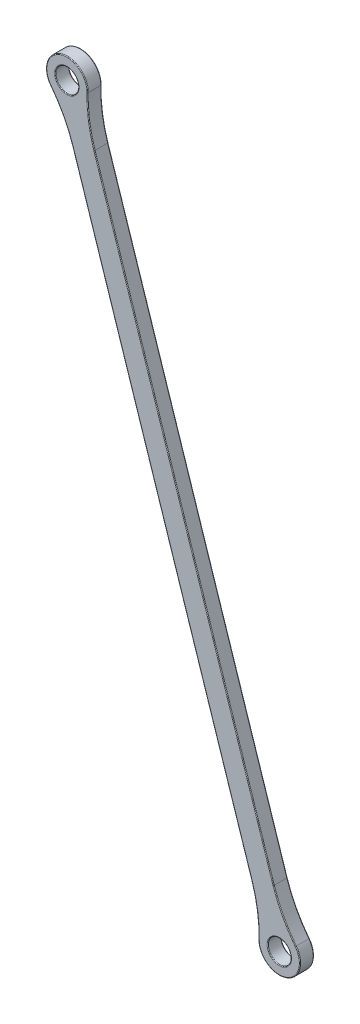
ISO-10303-21;
HEADER;
FILE_DESCRIPTION(('STEP AP214'),'2;1');
FILE_NAME('part.step','',(''),(''),'','','');
FILE_SCHEMA(('AUTOMOTIVE_DESIGN { 1 0 10303 214 1 1 1 1 }'));
ENDSEC;
DATA;
#1=APPLICATION_CONTEXT('core data for automotive mechanical design processes');
#2=APPLICATION_PROTOCOL_DEFINITION('international standard','automotive_design',2000,#1);
#3=PRODUCT_CONTEXT('',#1,'mechanical');
#4=PRODUCT('Part','Part','',(#3));
#5=PRODUCT_RELATED_PRODUCT_CATEGORY('part','',(#4));
#6=PRODUCT_DEFINITION_FORMATION('','',#4);
#7=PRODUCT_DEFINITION_CONTEXT('part definition',#1,'design');
#8=PRODUCT_DEFINITION('design','',#6,#7);
#9=PRODUCT_DEFINITION_SHAPE('','',#8);
#10=(LENGTH_UNIT() NAMED_UNIT(*) SI_UNIT(.MILLI.,.METRE.));
#11=(NAMED_UNIT(*) PLANE_ANGLE_UNIT() SI_UNIT($,.RADIAN.));
#12=(NAMED_UNIT(*) SI_UNIT($,.STERADIAN.) SOLID_ANGLE_UNIT());
#13=UNCERTAINTY_MEASURE_WITH_UNIT(LENGTH_MEASURE(1.E-05),#10,'distance_accuracy_value','');
#14=(GEOMETRIC_REPRESENTATION_CONTEXT(3) GLOBAL_UNCERTAINTY_ASSIGNED_CONTEXT((#13)) GLOBAL_UNIT_ASSIGNED_CONTEXT((#10,
#11,#12)) REPRESENTATION_CONTEXT('',''));
#15=CARTESIAN_POINT('',(0.,0.,0.));
#16=DIRECTION('',(0.,0.,1.));
#17=DIRECTION('',(1.,0.,0.));
#18=AXIS2_PLACEMENT_3D('',#15,#16,#17);
#19=CARTESIAN_POINT('',(-31.586941598819,222.141365942126,-3.));
#20=DIRECTION('',(0.,0.,1.));
#21=DIRECTION('',(1.,0.,0.));
#22=AXIS2_PLACEMENT_3D('',#19,#20,#21);
#23=CYLINDRICAL_SURFACE('',#22,4.5);
#24=DIRECTION('',(0.,0.,1.));
#25=VECTOR('',#24,1.);
#26=CARTESIAN_POINT('',(-27.0884051895222,222.026604562599,-3.));
#27=LINE('',#26,#25);
#28=CARTESIAN_POINT('',(-27.0884051895222,222.026604562599,-0.15));
#29=VERTEX_POINT('',#28);
#30=CARTESIAN_POINT('',(-27.0884051895222,222.026604562599,-2.85));
#31=VERTEX_POINT('',#30);
#32=EDGE_CURVE('E268',#29,#31,#27,.F.);
#33=ORIENTED_EDGE('',*,*,#32,.T.);
#34=CARTESIAN_POINT('',(-31.586941598819,222.141365942126,-2.85));
#35=DIRECTION('',(0.,0.,1.));
#36=DIRECTION('',(1.,0.,0.));
#37=AXIS2_PLACEMENT_3D('',#34,#35,#36);
#38=CIRCLE('',#37,4.5);
#39=CARTESIAN_POINT('',(-35.1451226862068,219.386488930469,-2.85));
#40=VERTEX_POINT('',#39);
#41=EDGE_CURVE('E219',#31,#40,#38,.T.);
#42=ORIENTED_EDGE('',*,*,#41,.T.);
#43=DIRECTION('',(0.,0.,1.));
#44=VECTOR('',#43,1.);
#45=CARTESIAN_POINT('',(-35.1451226862068,219.386488930469,-3.));
#46=LINE('',#45,#44);
#47=CARTESIAN_POINT('',(-35.1451226862068,219.386488930469,-0.15));
#48=VERTEX_POINT('',#47);
#49=EDGE_CURVE('E314',#40,#48,#46,.T.);
#50=ORIENTED_EDGE('',*,*,#49,.T.);
#51=CARTESIAN_POINT('',(-31.586941598819,222.141365942126,-0.15));
#52=DIRECTION('',(0.,0.,1.));
#53=DIRECTION('',(1.,0.,0.));
#54=AXIS2_PLACEMENT_3D('',#51,#52,#53);
#55=CIRCLE('',#54,4.5);
#56=EDGE_CURVE('E217',#48,#29,#55,.F.);
#57=ORIENTED_EDGE('',*,*,#56,.T.);
#58=EDGE_LOOP('',(#33,#42,#50,#57));
#59=FACE_BOUND('',#58,.T.);
#60=ADVANCED_FACE('F41',(#59),#23,.T.);
#61=CARTESIAN_POINT('',(39.5867533242614,12.9722317208782,-3.));
#62=DIRECTION('',(-0.950279499608961,-0.311398254046074,0.));
#63=DIRECTION('',(0.311398254046074,-0.950279499608961,0.));
#64=AXIS2_PLACEMENT_3D('',#61,#62,#63);
#65=PLANE('',#64);
#66=DIRECTION('',(0.,0.,1.));
#67=VECTOR('',#66,1.);
#68=CARTESIAN_POINT('',(13.2710033483714,93.2787761346538,-3.));
#69=LINE('',#68,#67);
#70=CARTESIAN_POINT('',(13.2710033483714,93.2787761346538,-0.15));
#71=VERTEX_POINT('',#70);
#72=CARTESIAN_POINT('',(13.2710033483714,93.2787761346538,-2.85));
#73=VERTEX_POINT('',#72);
#74=EDGE_CURVE('E316',#71,#73,#69,.F.);
#75=ORIENTED_EDGE('',*,*,#74,.T.);
#76=DIRECTION('',(0.311398254046074,-0.950279499608961,0.));
#77=VECTOR('',#76,1.);
#78=CARTESIAN_POINT('',(39.5867533242614,12.9722317208782,-2.85));
#79=LINE('',#78,#77);
#80=CARTESIAN_POINT('',(-25.6065474491456,211.919581077703,-2.85));
#81=VERTEX_POINT('',#80);
#82=EDGE_CURVE('E210',#73,#81,#79,.F.);
#83=ORIENTED_EDGE('',*,*,#82,.T.);
#84=DIRECTION('',(0.,0.,-1.));
#85=VECTOR('',#84,1.);
#86=CARTESIAN_POINT('',(-25.6065474491456,211.919581077703,0.));
#87=LINE('',#86,#85);
#88=CARTESIAN_POINT('',(-25.6065474491456,211.919581077703,-0.15));
#89=VERTEX_POINT('',#88);
#90=EDGE_CURVE('E324',#81,#89,#87,.F.);
#91=ORIENTED_EDGE('',*,*,#90,.T.);
#92=DIRECTION('',(0.311398254046074,-0.950279499608961,0.));
#93=VECTOR('',#92,1.);
#94=CARTESIAN_POINT('',(13.2710033483714,93.2787761346539,-0.15));
#95=LINE('',#94,#93);
#96=EDGE_CURVE('E208',#89,#71,#95,.T.);
#97=ORIENTED_EDGE('',*,*,#96,.T.);
#98=EDGE_LOOP('',(#75,#83,#91,#97));
#99=FACE_BOUND('',#98,.T.);
#100=ADVANCED_FACE('F396',(#99),#65,.F.);
#101=CARTESIAN_POINT('',(14.5,81.5000000000001,-3.));
#102=DIRECTION('',(0.,0.,1.));
#103=DIRECTION('',(1.,0.,0.));
#104=AXIS2_PLACEMENT_3D('',#101,#102,#103);
#105=CYLINDRICAL_SURFACE('',#104,4.5);
#106=DIRECTION('',(0.,0.,1.));
#107=VECTOR('',#106,1.);
#108=CARTESIAN_POINT('',(10.0014635907032,81.6147613795273,-3.));
#109=LINE('',#108,#107);
#110=CARTESIAN_POINT('',(10.0014635907032,81.6147613795273,-0.15));
#111=VERTEX_POINT('',#110);
#112=CARTESIAN_POINT('',(10.0014635907032,81.6147613795273,-2.85));
#113=VERTEX_POINT('',#112);
#114=EDGE_CURVE('E308',#111,#113,#109,.F.);
#115=ORIENTED_EDGE('',*,*,#114,.T.);
#116=CARTESIAN_POINT('',(14.5,81.5000000000001,-2.85));
#117=DIRECTION('',(0.,0.,1.));
#118=DIRECTION('',(1.,0.,0.));
#119=AXIS2_PLACEMENT_3D('',#116,#117,#118);
#120=CIRCLE('',#119,4.5);
#121=CARTESIAN_POINT('',(18.0581810873879,84.254877011657,-2.85));
#122=VERTEX_POINT('',#121);
#123=EDGE_CURVE('E202',#113,#122,#120,.T.);
#124=ORIENTED_EDGE('',*,*,#123,.T.);
#125=DIRECTION('',(0.,0.,1.));
#126=VECTOR('',#125,1.);
#127=CARTESIAN_POINT('',(18.0581810873879,84.254877011657,-3.));
#128=LINE('',#127,#126);
#129=CARTESIAN_POINT('',(18.0581810873879,84.254877011657,-0.15));
#130=VERTEX_POINT('',#129);
#131=EDGE_CURVE('E327',#122,#130,#128,.T.);
#132=ORIENTED_EDGE('',*,*,#131,.T.);
#133=CARTESIAN_POINT('',(14.5,81.5000000000001,-0.15));
#134=DIRECTION('',(0.,0.,1.));
#135=DIRECTION('',(1.,0.,0.));
#136=AXIS2_PLACEMENT_3D('',#133,#134,#135);
#137=CIRCLE('',#136,4.5);
#138=EDGE_CURVE('E200',#130,#111,#137,.F.);
#139=ORIENTED_EDGE('',*,*,#138,.T.);
#140=EDGE_LOOP('',(#115,#124,#132,#139));
#141=FACE_BOUND('',#140,.T.);
#142=ADVANCED_FACE('F351',(#141),#105,.T.);
#143=CARTESIAN_POINT('',(34.8353558262166,11.4152404506479,-3.));
#144=DIRECTION('',(-0.950279499608961,-0.311398254046074,0.));
#145=DIRECTION('',(0.311398254046074,-0.950279499608961,0.));
#146=AXIS2_PLACEMENT_3D('',#143,#144,#145);
#147=PLANE('',#146);
#148=DIRECTION('',(0.,0.,1.));
#149=VECTOR('',#148,1.);
#150=CARTESIAN_POINT('',(-30.3579449471904,210.362589807473,-3.));
#151=LINE('',#150,#149);
#152=CARTESIAN_POINT('',(-30.3579449471904,210.362589807473,-0.15));
#153=VERTEX_POINT('',#152);
#154=CARTESIAN_POINT('',(-30.3579449471904,210.362589807473,-2.85));
#155=VERTEX_POINT('',#154);
#156=EDGE_CURVE('E313',#153,#155,#151,.F.);
#157=ORIENTED_EDGE('',*,*,#156,.T.);
#158=DIRECTION('',(0.311398254046074,-0.950279499608961,0.));
#159=VECTOR('',#158,1.);
#160=CARTESIAN_POINT('',(8.51960585032661,91.7217848644236,-2.85));
#161=LINE('',#160,#159);
#162=CARTESIAN_POINT('',(8.51960585032663,91.7217848644235,-2.85));
#163=VERTEX_POINT('',#162);
#164=EDGE_CURVE('E227',#155,#163,#161,.T.);
#165=ORIENTED_EDGE('',*,*,#164,.T.);
#166=DIRECTION('',(0.,0.,-1.));
#167=VECTOR('',#166,1.);
#168=CARTESIAN_POINT('',(8.51960585032663,91.7217848644235,0.));
#169=LINE('',#168,#167);
#170=CARTESIAN_POINT('',(8.51960585032663,91.7217848644235,-0.15));
#171=VERTEX_POINT('',#170);
#172=EDGE_CURVE('E306',#163,#171,#169,.F.);
#173=ORIENTED_EDGE('',*,*,#172,.T.);
#174=DIRECTION('',(0.311398254046074,-0.950279499608961,0.));
#175=VECTOR('',#174,1.);
#176=CARTESIAN_POINT('',(34.8353558262166,11.4152404506479,-0.15));
#177=LINE('',#176,#175);
#178=EDGE_CURVE('E225',#171,#153,#177,.F.);
#179=ORIENTED_EDGE('',*,*,#178,.T.);
#180=EDGE_LOOP('',(#157,#165,#173,#179));
#181=FACE_BOUND('',#180,.T.);
#182=ADVANCED_FACE('F311',(#181),#147,.T.);
#183=CARTESIAN_POINT('',(14.5000000000001,81.5000000000002,-3.));
#184=DIRECTION('',(0.,0.,1.));
#185=DIRECTION('',(1.,0.,0.));
#186=AXIS2_PLACEMENT_3D('',#183,#184,#185);
#187=CYLINDRICAL_SURFACE('',#186,2.49999999999998);
#188=CARTESIAN_POINT('',(14.5000000000001,81.5000000000002,-2.85));
#189=DIRECTION('',(0.,0.,1.));
#190=DIRECTION('',(1.,0.,0.));
#191=AXIS2_PLACEMENT_3D('',#188,#189,#190);
#192=CIRCLE('',#191,2.49999999999998);
#193=CARTESIAN_POINT('',(17.,81.5000000000002,-2.85));
#194=VERTEX_POINT('',#193);
#195=EDGE_CURVE('E232',#194,#194,#192,.F.);
#196=ORIENTED_EDGE('',*,*,#195,.T.);
#197=EDGE_LOOP('',(#196));
#198=FACE_BOUND('',#197,.T.);
#199=CARTESIAN_POINT('',(14.5000000000001,81.5000000000002,-0.15));
#200=DIRECTION('',(0.,0.,1.));
#201=DIRECTION('',(1.,0.,0.));
#202=AXIS2_PLACEMENT_3D('',#199,#200,#201);
#203=CIRCLE('',#202,2.49999999999998);
#204=CARTESIAN_POINT('',(17.,81.5000000000002,-0.15));
#205=VERTEX_POINT('',#204);
#206=EDGE_CURVE('E229',#205,#205,#203,.T.);
#207=ORIENTED_EDGE('',*,*,#206,.T.);
#208=EDGE_LOOP('',(#207));
#209=FACE_BOUND('',#208,.T.);
#210=ADVANCED_FACE('F410',(#198,#209),#187,.F.);
#211=CARTESIAN_POINT('',(-31.586941598819,222.141365942126,-3.));
#212=DIRECTION('',(0.,0.,1.));
#213=DIRECTION('',(1.,0.,0.));
#214=AXIS2_PLACEMENT_3D('',#211,#212,#213);
#215=CYLINDRICAL_SURFACE('',#214,2.49999999999998);
#216=CARTESIAN_POINT('',(-31.586941598819,222.141365942126,-2.85));
#217=DIRECTION('',(0.,0.,1.));
#218=DIRECTION('',(1.,0.,0.));
#219=AXIS2_PLACEMENT_3D('',#216,#217,#218);
#220=CIRCLE('',#219,2.49999999999998);
#221=CARTESIAN_POINT('',(-29.086941598819,222.141365942126,-2.85));
#222=VERTEX_POINT('',#221);
#223=EDGE_CURVE('E194',#222,#222,#220,.F.);
#224=ORIENTED_EDGE('',*,*,#223,.T.);
#225=EDGE_LOOP('',(#224));
#226=FACE_BOUND('',#225,.T.);
#227=CARTESIAN_POINT('',(-31.586941598819,222.141365942126,-0.15));
#228=DIRECTION('',(0.,0.,1.));
#229=DIRECTION('',(1.,0.,0.));
#230=AXIS2_PLACEMENT_3D('',#227,#228,#229);
#231=CIRCLE('',#230,2.49999999999998);
#232=CARTESIAN_POINT('',(-29.086941598819,222.141365942126,-0.15));
#233=VERTEX_POINT('',#232);
#234=EDGE_CURVE('E186',#233,#233,#231,.T.);
#235=ORIENTED_EDGE('',*,*,#234,.T.);
#236=EDGE_LOOP('',(#235));
#237=FACE_BOUND('',#236,.T.);
#238=ADVANCED_FACE('F406',(#226,#237),#215,.F.);
#239=CARTESIAN_POINT('',(0.,0.,-3.));
#240=DIRECTION('',(0.,0.,1.));
#241=DIRECTION('',(1.,0.,0.));
#242=AXIS2_PLACEMENT_3D('',#239,#240,#241);
#243=PLANE('',#242);
#244=CARTESIAN_POINT('',(-31.586941598819,222.141365942126,-3.));
#245=DIRECTION('',(0.,0.,1.));
#246=DIRECTION('',(1.,0.,0.));
#247=AXIS2_PLACEMENT_3D('',#244,#245,#246);
#248=CIRCLE('',#247,2.64999999999998);
#249=CARTESIAN_POINT('',(-28.936941598819,222.141365942126,-3.));
#250=VERTEX_POINT('',#249);
#251=EDGE_CURVE('E183',#250,#250,#248,.T.);
#252=ORIENTED_EDGE('',*,*,#251,.T.);
#253=EDGE_LOOP('',(#252));
#254=FACE_BOUND('',#253,.T.);
#255=CARTESIAN_POINT('',(14.5,81.5000000000001,-3.));
#256=DIRECTION('',(0.,0.,1.));
#257=DIRECTION('',(1.,0.,0.));
#258=AXIS2_PLACEMENT_3D('',#255,#256,#257);
#259=CIRCLE('',#258,4.35);
#260=CARTESIAN_POINT('',(17.9395750511416,84.1630477779351,-3.));
#261=VERTEX_POINT('',#260);
#262=CARTESIAN_POINT('',(10.1514148043464,81.6109360002097,-3.));
#263=VERTEX_POINT('',#262);
#264=EDGE_CURVE('E181',#261,#263,#259,.F.);
#265=ORIENTED_EDGE('',*,*,#264,.T.);
#266=CARTESIAN_POINT('',(-19.9887791379422,82.3798372430413,-3.));
#267=DIRECTION('',(0.,0.,1.));
#268=DIRECTION('',(1.,0.,0.));
#269=AXIS2_PLACEMENT_3D('',#266,#267,#268);
#270=CIRCLE('',#269,30.15);
#271=CARTESIAN_POINT('',(8.66214777526797,91.7684946025304,-3.));
#272=VERTEX_POINT('',#271);
#273=EDGE_CURVE('E161',#263,#272,#270,.T.);
#274=ORIENTED_EDGE('',*,*,#273,.T.);
#275=DIRECTION('',(0.311398254046074,-0.950279499608961,0.));
#276=VECTOR('',#275,1.);
#277=CARTESIAN_POINT('',(-30.215403022249,210.40929954558,-3.));
#278=LINE('',#277,#276);
#279=CARTESIAN_POINT('',(-30.215403022249,210.40929954558,-3.));
#280=VERTEX_POINT('',#279);
#281=EDGE_CURVE('E169',#272,#280,#278,.F.);
#282=ORIENTED_EDGE('',*,*,#281,.T.);
#283=CARTESIAN_POINT('',(-58.8663299354591,201.02064218609,-3.));
#284=DIRECTION('',(0.,0.,1.));
#285=DIRECTION('',(1.,0.,0.));
#286=AXIS2_PLACEMENT_3D('',#283,#284,#285);
#287=CIRCLE('',#286,30.15);
#288=CARTESIAN_POINT('',(-35.0265166499605,219.478318164191,-3.));
#289=VERTEX_POINT('',#288);
#290=EDGE_CURVE('E175',#280,#289,#287,.T.);
#291=ORIENTED_EDGE('',*,*,#290,.T.);
#292=CARTESIAN_POINT('',(-31.586941598819,222.141365942126,-3.));
#293=DIRECTION('',(0.,0.,1.));
#294=DIRECTION('',(1.,0.,0.));
#295=AXIS2_PLACEMENT_3D('',#292,#293,#294);
#296=CIRCLE('',#295,4.35);
#297=CARTESIAN_POINT('',(-27.2383564031654,222.030429941917,-3.));
#298=VERTEX_POINT('',#297);
#299=EDGE_CURVE('E334',#289,#298,#296,.F.);
#300=ORIENTED_EDGE('',*,*,#299,.T.);
#301=CARTESIAN_POINT('',(2.90183753912325,221.261528699085,-3.));
#302=DIRECTION('',(0.,0.,1.));
#303=DIRECTION('',(1.,0.,0.));
#304=AXIS2_PLACEMENT_3D('',#301,#302,#303);
#305=CIRCLE('',#304,30.15);
#306=CARTESIAN_POINT('',(-25.7490893740869,211.872871339596,-3.));
#307=VERTEX_POINT('',#306);
#308=EDGE_CURVE('E336',#298,#307,#305,.T.);
#309=ORIENTED_EDGE('',*,*,#308,.T.);
#310=DIRECTION('',(0.311398254046074,-0.950279499608961,0.));
#311=VECTOR('',#310,1.);
#312=CARTESIAN_POINT('',(39.44421139932,12.9255219827713,-3.));
#313=LINE('',#312,#311);
#314=CARTESIAN_POINT('',(13.12846142343,93.2320663965469,-3.));
#315=VERTEX_POINT('',#314);
#316=EDGE_CURVE('E338',#307,#315,#313,.T.);
#317=ORIENTED_EDGE('',*,*,#316,.T.);
#318=CARTESIAN_POINT('',(41.7793883366402,102.620723756036,-3.));
#319=DIRECTION('',(0.,0.,1.));
#320=DIRECTION('',(1.,0.,0.));
#321=AXIS2_PLACEMENT_3D('',#318,#319,#320);
#322=CIRCLE('',#321,30.15);
#323=EDGE_CURVE('E188',#315,#261,#322,.T.);
#324=ORIENTED_EDGE('',*,*,#323,.T.);
#325=EDGE_LOOP('',(#265,#274,#282,#291,#300,#309,#317,#324));
#326=FACE_BOUND('',#325,.T.);
#327=CARTESIAN_POINT('',(14.5000000000001,81.5000000000002,-3.));
#328=DIRECTION('',(0.,0.,1.));
#329=DIRECTION('',(1.,0.,0.));
#330=AXIS2_PLACEMENT_3D('',#327,#328,#329);
#331=CIRCLE('',#330,2.64999999999998);
#332=CARTESIAN_POINT('',(17.15,81.5000000000002,-3.));
#333=VERTEX_POINT('',#332);
#334=EDGE_CURVE('E176',#333,#333,#331,.T.);
#335=ORIENTED_EDGE('',*,*,#334,.T.);
#336=EDGE_LOOP('',(#335));
#337=FACE_BOUND('',#336,.T.);
#338=ADVANCED_FACE('F178',(#254,#326,#337),#243,.F.);
#339=CARTESIAN_POINT('',(0.,0.,0.));
#340=DIRECTION('',(0.,0.,1.));
#341=DIRECTION('',(1.,0.,0.));
#342=AXIS2_PLACEMENT_3D('',#339,#340,#341);
#343=PLANE('',#342);
#344=CARTESIAN_POINT('',(-31.586941598819,222.141365942126,0.));
#345=DIRECTION('',(0.,0.,1.));
#346=DIRECTION('',(1.,0.,0.));
#347=AXIS2_PLACEMENT_3D('',#344,#345,#346);
#348=CIRCLE('',#347,2.64999999999998);
#349=CARTESIAN_POINT('',(-28.936941598819,222.141365942126,0.));
#350=VERTEX_POINT('',#349);
#351=EDGE_CURVE('E11',#350,#350,#348,.F.);
#352=ORIENTED_EDGE('',*,*,#351,.T.);
#353=EDGE_LOOP('',(#352));
#354=FACE_BOUND('',#353,.T.);
#355=DIRECTION('',(0.311398254046074,-0.950279499608961,0.));
#356=VECTOR('',#355,1.);
#357=CARTESIAN_POINT('',(-25.7490893740869,211.872871339596,0.));
#358=LINE('',#357,#356);
#359=CARTESIAN_POINT('',(13.12846142343,93.2320663965469,0.));
#360=VERTEX_POINT('',#359);
#361=CARTESIAN_POINT('',(-25.7490893740869,211.872871339596,0.));
#362=VERTEX_POINT('',#361);
#363=EDGE_CURVE('E58',#360,#362,#358,.F.);
#364=ORIENTED_EDGE('',*,*,#363,.T.);
#365=CARTESIAN_POINT('',(2.90183753912325,221.261528699085,0.));
#366=DIRECTION('',(0.,0.,1.));
#367=DIRECTION('',(1.,0.,0.));
#368=AXIS2_PLACEMENT_3D('',#365,#366,#367);
#369=CIRCLE('',#368,30.15);
#370=CARTESIAN_POINT('',(-27.2383564031654,222.030429941917,0.));
#371=VERTEX_POINT('',#370);
#372=EDGE_CURVE('E50',#362,#371,#369,.F.);
#373=ORIENTED_EDGE('',*,*,#372,.T.);
#374=CARTESIAN_POINT('',(-31.586941598819,222.141365942126,0.));
#375=DIRECTION('',(0.,0.,1.));
#376=DIRECTION('',(1.,0.,0.));
#377=AXIS2_PLACEMENT_3D('',#374,#375,#376);
#378=CIRCLE('',#377,4.35);
#379=CARTESIAN_POINT('',(-35.0265166499605,219.478318164191,0.));
#380=VERTEX_POINT('',#379);
#381=EDGE_CURVE('E238',#371,#380,#378,.T.);
#382=ORIENTED_EDGE('',*,*,#381,.T.);
#383=CARTESIAN_POINT('',(-58.8663299354591,201.02064218609,0.));
#384=DIRECTION('',(0.,0.,1.));
#385=DIRECTION('',(1.,0.,0.));
#386=AXIS2_PLACEMENT_3D('',#383,#384,#385);
#387=CIRCLE('',#386,30.15);
#388=CARTESIAN_POINT('',(-30.215403022249,210.40929954558,0.));
#389=VERTEX_POINT('',#388);
#390=EDGE_CURVE('E240',#380,#389,#387,.F.);
#391=ORIENTED_EDGE('',*,*,#390,.T.);
#392=DIRECTION('',(0.311398254046074,-0.950279499608961,0.));
#393=VECTOR('',#392,1.);
#394=CARTESIAN_POINT('',(34.977897751158,11.4619501887548,0.));
#395=LINE('',#394,#393);
#396=CARTESIAN_POINT('',(8.66214777526798,91.7684946025304,0.));
#397=VERTEX_POINT('',#396);
#398=EDGE_CURVE('E242',#389,#397,#395,.T.);
#399=ORIENTED_EDGE('',*,*,#398,.T.);
#400=CARTESIAN_POINT('',(-19.9887791379422,82.3798372430413,0.));
#401=DIRECTION('',(0.,0.,1.));
#402=DIRECTION('',(1.,0.,0.));
#403=AXIS2_PLACEMENT_3D('',#400,#401,#402);
#404=CIRCLE('',#403,30.15);
#405=CARTESIAN_POINT('',(10.1514148043464,81.6109360002097,0.));
#406=VERTEX_POINT('',#405);
#407=EDGE_CURVE('E244',#397,#406,#404,.F.);
#408=ORIENTED_EDGE('',*,*,#407,.T.);
#409=CARTESIAN_POINT('',(14.5,81.5000000000001,0.));
#410=DIRECTION('',(0.,0.,1.));
#411=DIRECTION('',(1.,0.,0.));
#412=AXIS2_PLACEMENT_3D('',#409,#410,#411);
#413=CIRCLE('',#412,4.35);
#414=CARTESIAN_POINT('',(17.9395750511416,84.1630477779351,0.));
#415=VERTEX_POINT('',#414);
#416=EDGE_CURVE('E246',#406,#415,#413,.T.);
#417=ORIENTED_EDGE('',*,*,#416,.T.);
#418=CARTESIAN_POINT('',(41.7793883366402,102.620723756036,0.));
#419=DIRECTION('',(0.,0.,1.));
#420=DIRECTION('',(1.,0.,0.));
#421=AXIS2_PLACEMENT_3D('',#418,#419,#420);
#422=CIRCLE('',#421,30.15);
#423=EDGE_CURVE('E63',#415,#360,#422,.F.);
#424=ORIENTED_EDGE('',*,*,#423,.T.);
#425=EDGE_LOOP('',(#364,#373,#382,#391,#399,#408,#417,#424));
#426=FACE_BOUND('',#425,.T.);
#427=CARTESIAN_POINT('',(14.5000000000001,81.5000000000002,0.));
#428=DIRECTION('',(0.,0.,1.));
#429=DIRECTION('',(1.,0.,0.));
#430=AXIS2_PLACEMENT_3D('',#427,#428,#429);
#431=CIRCLE('',#430,2.64999999999998);
#432=CARTESIAN_POINT('',(17.15,81.5000000000002,0.));
#433=VERTEX_POINT('',#432);
#434=EDGE_CURVE('E235',#433,#433,#431,.F.);
#435=ORIENTED_EDGE('',*,*,#434,.T.);
#436=EDGE_LOOP('',(#435));
#437=FACE_BOUND('',#436,.T.);
#438=ADVANCED_FACE('F367',(#354,#426,#437),#343,.T.);
#439=CARTESIAN_POINT('',(-58.8663299354591,201.02064218609,-3.));
#440=DIRECTION('',(0.,0.,1.));
#441=DIRECTION('',(1.,0.,0.));
#442=AXIS2_PLACEMENT_3D('',#439,#440,#441);
#443=CYLINDRICAL_SURFACE('',#442,30.);
#444=ORIENTED_EDGE('',*,*,#49,.F.);
#445=CARTESIAN_POINT('',(-58.8663299354591,201.02064218609,-2.85));
#446=DIRECTION('',(0.,0.,1.));
#447=DIRECTION('',(1.,0.,0.));
#448=AXIS2_PLACEMENT_3D('',#445,#446,#447);
#449=CIRCLE('',#448,30.);
#450=EDGE_CURVE('E223',#40,#155,#449,.F.);
#451=ORIENTED_EDGE('',*,*,#450,.T.);
#452=ORIENTED_EDGE('',*,*,#156,.F.);
#453=CARTESIAN_POINT('',(-58.8663299354591,201.02064218609,-0.15));
#454=DIRECTION('',(0.,0.,1.));
#455=DIRECTION('',(1.,0.,0.));
#456=AXIS2_PLACEMENT_3D('',#453,#454,#455);
#457=CIRCLE('',#456,30.);
#458=EDGE_CURVE('E221',#153,#48,#457,.T.);
#459=ORIENTED_EDGE('',*,*,#458,.T.);
#460=EDGE_LOOP('',(#444,#451,#452,#459));
#461=FACE_BOUND('',#460,.T.);
#462=ADVANCED_FACE('F415',(#461),#443,.F.);
#463=CARTESIAN_POINT('',(2.90183753912325,221.261528699085,-3.));
#464=DIRECTION('',(0.,0.,1.));
#465=DIRECTION('',(1.,0.,0.));
#466=AXIS2_PLACEMENT_3D('',#463,#464,#465);
#467=CYLINDRICAL_SURFACE('',#466,30.);
#468=ORIENTED_EDGE('',*,*,#90,.F.);
#469=CARTESIAN_POINT('',(2.90183753912325,221.261528699085,-2.85));
#470=DIRECTION('',(0.,0.,1.));
#471=DIRECTION('',(1.,0.,0.));
#472=AXIS2_PLACEMENT_3D('',#469,#470,#471);
#473=CIRCLE('',#472,30.);
#474=EDGE_CURVE('E215',#81,#31,#473,.F.);
#475=ORIENTED_EDGE('',*,*,#474,.T.);
#476=ORIENTED_EDGE('',*,*,#32,.F.);
#477=CARTESIAN_POINT('',(2.90183753912325,221.261528699085,-0.15));
#478=DIRECTION('',(0.,0.,1.));
#479=DIRECTION('',(1.,0.,0.));
#480=AXIS2_PLACEMENT_3D('',#477,#478,#479);
#481=CIRCLE('',#480,30.);
#482=EDGE_CURVE('E212',#29,#89,#481,.T.);
#483=ORIENTED_EDGE('',*,*,#482,.T.);
#484=EDGE_LOOP('',(#468,#475,#476,#483));
#485=FACE_BOUND('',#484,.T.);
#486=ADVANCED_FACE('F385',(#485),#467,.F.);
#487=CARTESIAN_POINT('',(-19.9887791379422,82.3798372430413,-3.));
#488=DIRECTION('',(0.,0.,1.));
#489=DIRECTION('',(1.,0.,0.));
#490=AXIS2_PLACEMENT_3D('',#487,#488,#489);
#491=CYLINDRICAL_SURFACE('',#490,30.);
#492=ORIENTED_EDGE('',*,*,#172,.F.);
#493=CARTESIAN_POINT('',(-19.9887791379422,82.3798372430413,-2.85));
#494=DIRECTION('',(0.,0.,1.));
#495=DIRECTION('',(1.,0.,0.));
#496=AXIS2_PLACEMENT_3D('',#493,#494,#495);
#497=CIRCLE('',#496,30.);
#498=EDGE_CURVE('E163',#163,#113,#497,.F.);
#499=ORIENTED_EDGE('',*,*,#498,.T.);
#500=ORIENTED_EDGE('',*,*,#114,.F.);
#501=CARTESIAN_POINT('',(-19.9887791379422,82.3798372430413,-0.15));
#502=DIRECTION('',(0.,0.,1.));
#503=DIRECTION('',(1.,0.,0.));
#504=AXIS2_PLACEMENT_3D('',#501,#502,#503);
#505=CIRCLE('',#504,30.);
#506=EDGE_CURVE('E197',#111,#171,#505,.T.);
#507=ORIENTED_EDGE('',*,*,#506,.T.);
#508=EDGE_LOOP('',(#492,#499,#500,#507));
#509=FACE_BOUND('',#508,.T.);
#510=ADVANCED_FACE('F305',(#509),#491,.F.);
#511=CARTESIAN_POINT('',(41.7793883366402,102.620723756036,-3.));
#512=DIRECTION('',(0.,0.,1.));
#513=DIRECTION('',(1.,0.,0.));
#514=AXIS2_PLACEMENT_3D('',#511,#512,#513);
#515=CYLINDRICAL_SURFACE('',#514,30.);
#516=ORIENTED_EDGE('',*,*,#131,.F.);
#517=CARTESIAN_POINT('',(41.7793883366402,102.620723756036,-2.85));
#518=DIRECTION('',(0.,0.,1.));
#519=DIRECTION('',(1.,0.,0.));
#520=AXIS2_PLACEMENT_3D('',#517,#518,#519);
#521=CIRCLE('',#520,30.);
#522=EDGE_CURVE('E206',#122,#73,#521,.F.);
#523=ORIENTED_EDGE('',*,*,#522,.T.);
#524=ORIENTED_EDGE('',*,*,#74,.F.);
#525=CARTESIAN_POINT('',(41.7793883366402,102.620723756036,-0.15));
#526=DIRECTION('',(0.,0.,1.));
#527=DIRECTION('',(1.,0.,0.));
#528=AXIS2_PLACEMENT_3D('',#525,#526,#527);
#529=CIRCLE('',#528,30.);
#530=EDGE_CURVE('E204',#71,#130,#529,.T.);
#531=ORIENTED_EDGE('',*,*,#530,.T.);
#532=EDGE_LOOP('',(#516,#523,#524,#531));
#533=FACE_BOUND('',#532,.T.);
#534=ADVANCED_FACE('F353',(#533),#515,.F.);
#535=CARTESIAN_POINT('',(-31.586941598819,222.141365942126,-2.85));
#536=DIRECTION('',(0.,0.,1.));
#537=DIRECTION('',(1.,0.,0.));
#538=AXIS2_PLACEMENT_3D('',#535,#536,#537);
#539=TOROIDAL_SURFACE('',#538,2.64999999999998,0.15);
#540=ORIENTED_EDGE('',*,*,#223,.F.);
#541=EDGE_LOOP('',(#540));
#542=FACE_BOUND('',#541,.T.);
#543=ORIENTED_EDGE('',*,*,#251,.F.);
#544=EDGE_LOOP('',(#543));
#545=FACE_BOUND('',#544,.T.);
#546=ADVANCED_FACE('F425',(#542,#545),#539,.T.);
#547=CARTESIAN_POINT('',(2.90183753912325,221.261528699085,-2.85));
#548=DIRECTION('',(0.,0.,1.));
#549=DIRECTION('',(1.,0.,0.));
#550=AXIS2_PLACEMENT_3D('',#547,#548,#549);
#551=TOROIDAL_SURFACE('',#550,30.15,0.15);
#552=CARTESIAN_POINT('',(-27.2383564031654,222.030429941917,-2.85));
#553=DIRECTION('',(0.0255025287837496,0.999674757621515,0.));
#554=DIRECTION('',(-0.999674757621515,0.0255025287837496,0.));
#555=AXIS2_PLACEMENT_3D('',#552,#553,#554);
#556=CIRCLE('',#555,0.15);
#557=EDGE_CURVE('E262',#31,#298,#556,.T.);
#558=ORIENTED_EDGE('',*,*,#557,.F.);
#559=ORIENTED_EDGE('',*,*,#474,.F.);
#560=CARTESIAN_POINT('',(-25.7490893740869,211.872871339596,-2.85));
#561=DIRECTION('',(0.311398254046101,-0.950279499608952,0.));
#562=DIRECTION('',(0.950279499608952,0.311398254046101,0.));
#563=AXIS2_PLACEMENT_3D('',#560,#561,#562);
#564=CIRCLE('',#563,0.15);
#565=EDGE_CURVE('E265',#307,#81,#564,.T.);
#566=ORIENTED_EDGE('',*,*,#565,.F.);
#567=ORIENTED_EDGE('',*,*,#308,.F.);
#568=EDGE_LOOP('',(#558,#559,#566,#567));
#569=FACE_BOUND('',#568,.T.);
#570=ADVANCED_FACE('F389',(#569),#551,.T.);
#571=CARTESIAN_POINT('',(39.44421139932,12.9255219827713,-2.85));
#572=DIRECTION('',(0.311398254046074,-0.950279499608961,0.));
#573=DIRECTION('',(0.950279499608961,0.311398254046074,0.));
#574=AXIS2_PLACEMENT_3D('',#571,#572,#573);
#575=CYLINDRICAL_SURFACE('',#574,0.15);
#576=ORIENTED_EDGE('',*,*,#565,.T.);
#577=ORIENTED_EDGE('',*,*,#82,.F.);
#578=CARTESIAN_POINT('',(13.12846142343,93.2320663965469,-2.85));
#579=DIRECTION('',(0.311398254046091,-0.950279499608955,0.));
#580=DIRECTION('',(0.950279499608955,0.311398254046091,0.));
#581=AXIS2_PLACEMENT_3D('',#578,#579,#580);
#582=CIRCLE('',#581,0.15);
#583=EDGE_CURVE('E259',#315,#73,#582,.T.);
#584=ORIENTED_EDGE('',*,*,#583,.F.);
#585=ORIENTED_EDGE('',*,*,#316,.F.);
#586=EDGE_LOOP('',(#576,#577,#584,#585));
#587=FACE_BOUND('',#586,.T.);
#588=ADVANCED_FACE('F394',(#587),#575,.T.);
#589=CARTESIAN_POINT('',(-31.586941598819,222.141365942126,-2.85));
#590=DIRECTION('',(0.,0.,1.));
#591=DIRECTION('',(1.,0.,0.));
#592=AXIS2_PLACEMENT_3D('',#589,#590,#591);
#593=TOROIDAL_SURFACE('',#592,4.35,0.15);
#594=ORIENTED_EDGE('',*,*,#557,.T.);
#595=ORIENTED_EDGE('',*,*,#299,.F.);
#596=CARTESIAN_POINT('',(-35.0265166499605,219.478318164191,-2.85));
#597=DIRECTION('',(0.612194891479278,-0.79070690830843,0.));
#598=DIRECTION('',(0.79070690830843,0.612194891479278,0.));
#599=AXIS2_PLACEMENT_3D('',#596,#597,#598);
#600=CIRCLE('',#599,0.15);
#601=EDGE_CURVE('E256',#40,#289,#600,.T.);
#602=ORIENTED_EDGE('',*,*,#601,.F.);
#603=ORIENTED_EDGE('',*,*,#41,.F.);
#604=EDGE_LOOP('',(#594,#595,#602,#603));
#605=FACE_BOUND('',#604,.T.);
#606=ADVANCED_FACE('F442',(#605),#593,.T.);
#607=CARTESIAN_POINT('',(41.7793883366402,102.620723756036,-2.85));
#608=DIRECTION('',(0.,0.,1.));
#609=DIRECTION('',(1.,0.,0.));
#610=AXIS2_PLACEMENT_3D('',#607,#608,#609);
#611=TOROIDAL_SURFACE('',#610,30.15,0.15);
#612=ORIENTED_EDGE('',*,*,#583,.T.);
#613=ORIENTED_EDGE('',*,*,#522,.F.);
#614=CARTESIAN_POINT('',(17.9395750511416,84.1630477779351,-2.85));
#615=DIRECTION('',(0.612194891479289,-0.790706908308421,0.));
#616=DIRECTION('',(0.790706908308421,0.612194891479289,0.));
#617=AXIS2_PLACEMENT_3D('',#614,#615,#616);
#618=CIRCLE('',#617,0.15);
#619=EDGE_CURVE('E253',#261,#122,#618,.T.);
#620=ORIENTED_EDGE('',*,*,#619,.F.);
#621=ORIENTED_EDGE('',*,*,#323,.F.);
#622=EDGE_LOOP('',(#612,#613,#620,#621));
#623=FACE_BOUND('',#622,.T.);
#624=ADVANCED_FACE('F345',(#623),#611,.T.);
#625=CARTESIAN_POINT('',(-58.8663299354591,201.02064218609,-2.85));
#626=DIRECTION('',(0.,0.,1.));
#627=DIRECTION('',(1.,0.,0.));
#628=AXIS2_PLACEMENT_3D('',#625,#626,#627);
#629=TOROIDAL_SURFACE('',#628,30.15,0.15);
#630=ORIENTED_EDGE('',*,*,#601,.T.);
#631=ORIENTED_EDGE('',*,*,#290,.F.);
#632=CARTESIAN_POINT('',(-30.215403022249,210.40929954558,-2.85));
#633=DIRECTION('',(0.311398254046094,-0.950279499608954,0.));
#634=DIRECTION('',(0.950279499608954,0.311398254046094,0.));
#635=AXIS2_PLACEMENT_3D('',#632,#633,#634);
#636=CIRCLE('',#635,0.15);
#637=EDGE_CURVE('E172',#155,#280,#636,.T.);
#638=ORIENTED_EDGE('',*,*,#637,.F.);
#639=ORIENTED_EDGE('',*,*,#450,.F.);
#640=EDGE_LOOP('',(#630,#631,#638,#639));
#641=FACE_BOUND('',#640,.T.);
#642=ADVANCED_FACE('F436',(#641),#629,.T.);
#643=CARTESIAN_POINT('',(14.5,81.5000000000001,-2.85));
#644=DIRECTION('',(0.,0.,1.));
#645=DIRECTION('',(1.,0.,0.));
#646=AXIS2_PLACEMENT_3D('',#643,#644,#645);
#647=TOROIDAL_SURFACE('',#646,4.35,0.15);
#648=ORIENTED_EDGE('',*,*,#619,.T.);
#649=ORIENTED_EDGE('',*,*,#123,.F.);
#650=CARTESIAN_POINT('',(10.1514148043464,81.6109360002097,-2.85));
#651=DIRECTION('',(0.0255025287838421,0.999674757621512,0.));
#652=DIRECTION('',(-0.999674757621512,0.0255025287838421,0.));
#653=AXIS2_PLACEMENT_3D('',#650,#651,#652);
#654=CIRCLE('',#653,0.15);
#655=EDGE_CURVE('E166',#263,#113,#654,.T.);
#656=ORIENTED_EDGE('',*,*,#655,.F.);
#657=ORIENTED_EDGE('',*,*,#264,.F.);
#658=EDGE_LOOP('',(#648,#649,#656,#657));
#659=FACE_BOUND('',#658,.T.);
#660=ADVANCED_FACE('F348',(#659),#647,.T.);
#661=CARTESIAN_POINT('',(34.977897751158,11.4619501887548,-2.85));
#662=DIRECTION('',(-0.311398254046074,0.950279499608961,0.));
#663=DIRECTION('',(-0.950279499608961,-0.311398254046074,0.));
#664=AXIS2_PLACEMENT_3D('',#661,#662,#663);
#665=CYLINDRICAL_SURFACE('',#664,0.15);
#666=ORIENTED_EDGE('',*,*,#637,.T.);
#667=ORIENTED_EDGE('',*,*,#281,.F.);
#668=CARTESIAN_POINT('',(8.66214777526798,91.7684946025304,-2.85));
#669=DIRECTION('',(0.311398254046098,-0.950279499608953,0.));
#670=DIRECTION('',(0.950279499608953,0.311398254046098,0.));
#671=AXIS2_PLACEMENT_3D('',#668,#669,#670);
#672=CIRCLE('',#671,0.15);
#673=EDGE_CURVE('E157',#163,#272,#672,.T.);
#674=ORIENTED_EDGE('',*,*,#673,.F.);
#675=ORIENTED_EDGE('',*,*,#164,.F.);
#676=EDGE_LOOP('',(#666,#667,#674,#675));
#677=FACE_BOUND('',#676,.T.);
#678=ADVANCED_FACE('F170',(#677),#665,.T.);
#679=CARTESIAN_POINT('',(-19.9887791379422,82.3798372430413,-2.85));
#680=DIRECTION('',(0.,0.,1.));
#681=DIRECTION('',(1.,0.,0.));
#682=AXIS2_PLACEMENT_3D('',#679,#680,#681);
#683=TOROIDAL_SURFACE('',#682,30.15,0.15);
#684=ORIENTED_EDGE('',*,*,#655,.T.);
#685=ORIENTED_EDGE('',*,*,#498,.F.);
#686=ORIENTED_EDGE('',*,*,#673,.T.);
#687=ORIENTED_EDGE('',*,*,#273,.F.);
#688=EDGE_LOOP('',(#684,#685,#686,#687));
#689=FACE_BOUND('',#688,.T.);
#690=ADVANCED_FACE('F159',(#689),#683,.T.);
#691=CARTESIAN_POINT('',(14.5000000000001,81.5000000000002,-2.85));
#692=DIRECTION('',(0.,0.,1.));
#693=DIRECTION('',(1.,0.,0.));
#694=AXIS2_PLACEMENT_3D('',#691,#692,#693);
#695=TOROIDAL_SURFACE('',#694,2.64999999999998,0.15);
#696=ORIENTED_EDGE('',*,*,#195,.F.);
#697=EDGE_LOOP('',(#696));
#698=FACE_BOUND('',#697,.T.);
#699=ORIENTED_EDGE('',*,*,#334,.F.);
#700=EDGE_LOOP('',(#699));
#701=FACE_BOUND('',#700,.T.);
#702=ADVANCED_FACE('F431',(#698,#701),#695,.T.);
#703=CARTESIAN_POINT('',(-31.586941598819,222.141365942126,-0.15));
#704=DIRECTION('',(0.,0.,1.));
#705=DIRECTION('',(1.,0.,0.));
#706=AXIS2_PLACEMENT_3D('',#703,#704,#705);
#707=TOROIDAL_SURFACE('',#706,2.64999999999998,0.15);
#708=ORIENTED_EDGE('',*,*,#351,.F.);
#709=EDGE_LOOP('',(#708));
#710=FACE_BOUND('',#709,.T.);
#711=ORIENTED_EDGE('',*,*,#234,.F.);
#712=EDGE_LOOP('',(#711));
#713=FACE_BOUND('',#712,.T.);
#714=ADVANCED_FACE('F452',(#710,#713),#707,.T.);
#715=CARTESIAN_POINT('',(-19.9887791379422,82.3798372430413,-0.15));
#716=DIRECTION('',(0.,0.,1.));
#717=DIRECTION('',(1.,0.,0.));
#718=AXIS2_PLACEMENT_3D('',#715,#716,#717);
#719=TOROIDAL_SURFACE('',#718,30.15,0.15);
#720=CARTESIAN_POINT('',(8.66214777526798,91.7684946025304,-0.15));
#721=DIRECTION('',(-0.311398254046098,0.950279499608953,0.));
#722=DIRECTION('',(-0.950279499608953,-0.311398254046098,0.));
#723=AXIS2_PLACEMENT_3D('',#720,#721,#722);
#724=CIRCLE('',#723,0.15);
#725=EDGE_CURVE('E284',#171,#397,#724,.T.);
#726=ORIENTED_EDGE('',*,*,#725,.F.);
#727=ORIENTED_EDGE('',*,*,#506,.F.);
#728=CARTESIAN_POINT('',(10.1514148043464,81.6109360002097,-0.15));
#729=DIRECTION('',(-0.0255025287838421,-0.999674757621512,0.));
#730=DIRECTION('',(0.999674757621512,-0.0255025287838421,0.));
#731=AXIS2_PLACEMENT_3D('',#728,#729,#730);
#732=CIRCLE('',#731,0.15);
#733=EDGE_CURVE('E45',#406,#111,#732,.T.);
#734=ORIENTED_EDGE('',*,*,#733,.F.);
#735=ORIENTED_EDGE('',*,*,#407,.F.);
#736=EDGE_LOOP('',(#726,#727,#734,#735));
#737=FACE_BOUND('',#736,.T.);
#738=ADVANCED_FACE('F300',(#737),#719,.T.);
#739=CARTESIAN_POINT('',(14.5,81.5000000000001,-0.15));
#740=DIRECTION('',(0.,0.,1.));
#741=DIRECTION('',(1.,0.,0.));
#742=AXIS2_PLACEMENT_3D('',#739,#740,#741);
#743=TOROIDAL_SURFACE('',#742,4.35,0.15);
#744=ORIENTED_EDGE('',*,*,#733,.T.);
#745=ORIENTED_EDGE('',*,*,#138,.F.);
#746=CARTESIAN_POINT('',(17.9395750511416,84.1630477779351,-0.15));
#747=DIRECTION('',(-0.612194891479278,0.79070690830843,0.));
#748=DIRECTION('',(-0.79070690830843,-0.612194891479278,0.));
#749=AXIS2_PLACEMENT_3D('',#746,#747,#748);
#750=CIRCLE('',#749,0.15);
#751=EDGE_CURVE('E282',#415,#130,#750,.T.);
#752=ORIENTED_EDGE('',*,*,#751,.F.);
#753=ORIENTED_EDGE('',*,*,#416,.F.);
#754=EDGE_LOOP('',(#744,#745,#752,#753));
#755=FACE_BOUND('',#754,.T.);
#756=ADVANCED_FACE('F295',(#755),#743,.T.);
#757=CARTESIAN_POINT('',(34.977897751158,11.4619501887548,-0.15));
#758=DIRECTION('',(0.311398254046074,-0.950279499608961,0.));
#759=DIRECTION('',(0.950279499608961,0.311398254046074,0.));
#760=AXIS2_PLACEMENT_3D('',#757,#758,#759);
#761=CYLINDRICAL_SURFACE('',#760,0.15);
#762=ORIENTED_EDGE('',*,*,#725,.T.);
#763=ORIENTED_EDGE('',*,*,#398,.F.);
#764=CARTESIAN_POINT('',(-30.215403022249,210.40929954558,-0.15));
#765=DIRECTION('',(-0.311398254046094,0.950279499608954,0.));
#766=DIRECTION('',(-0.950279499608954,-0.311398254046094,0.));
#767=AXIS2_PLACEMENT_3D('',#764,#765,#766);
#768=CIRCLE('',#767,0.15);
#769=EDGE_CURVE('E279',#153,#389,#768,.T.);
#770=ORIENTED_EDGE('',*,*,#769,.F.);
#771=ORIENTED_EDGE('',*,*,#178,.F.);
#772=EDGE_LOOP('',(#762,#763,#770,#771));
#773=FACE_BOUND('',#772,.T.);
#774=ADVANCED_FACE('F467',(#773),#761,.T.);
#775=CARTESIAN_POINT('',(41.7793883366402,102.620723756036,-0.15));
#776=DIRECTION('',(0.,0.,1.));
#777=DIRECTION('',(1.,0.,0.));
#778=AXIS2_PLACEMENT_3D('',#775,#776,#777);
#779=TOROIDAL_SURFACE('',#778,30.15,0.15);
#780=ORIENTED_EDGE('',*,*,#751,.T.);
#781=ORIENTED_EDGE('',*,*,#530,.F.);
#782=CARTESIAN_POINT('',(13.12846142343,93.2320663965469,-0.15));
#783=DIRECTION('',(-0.311398254046094,0.950279499608954,0.));
#784=DIRECTION('',(-0.950279499608954,-0.311398254046094,0.));
#785=AXIS2_PLACEMENT_3D('',#782,#783,#784);
#786=CIRCLE('',#785,0.15);
#787=EDGE_CURVE('E276',#360,#71,#786,.T.);
#788=ORIENTED_EDGE('',*,*,#787,.F.);
#789=ORIENTED_EDGE('',*,*,#423,.F.);
#790=EDGE_LOOP('',(#780,#781,#788,#789));
#791=FACE_BOUND('',#790,.T.);
#792=ADVANCED_FACE('F357',(#791),#779,.T.);
#793=CARTESIAN_POINT('',(-58.8663299354591,201.02064218609,-0.15));
#794=DIRECTION('',(0.,0.,1.));
#795=DIRECTION('',(1.,0.,0.));
#796=AXIS2_PLACEMENT_3D('',#793,#794,#795);
#797=TOROIDAL_SURFACE('',#796,30.15,0.15);
#798=ORIENTED_EDGE('',*,*,#769,.T.);
#799=ORIENTED_EDGE('',*,*,#390,.F.);
#800=CARTESIAN_POINT('',(-35.0265166499605,219.478318164191,-0.15));
#801=DIRECTION('',(-0.612194891479278,0.79070690830843,0.));
#802=DIRECTION('',(-0.79070690830843,-0.612194891479278,0.));
#803=AXIS2_PLACEMENT_3D('',#800,#801,#802);
#804=CIRCLE('',#803,0.15);
#805=EDGE_CURVE('E273',#48,#380,#804,.T.);
#806=ORIENTED_EDGE('',*,*,#805,.F.);
#807=ORIENTED_EDGE('',*,*,#458,.F.);
#808=EDGE_LOOP('',(#798,#799,#806,#807));
#809=FACE_BOUND('',#808,.T.);
#810=ADVANCED_FACE('F373',(#809),#797,.T.);
#811=CARTESIAN_POINT('',(39.44421139932,12.9255219827713,-0.15));
#812=DIRECTION('',(-0.311398254046074,0.950279499608961,0.));
#813=DIRECTION('',(-0.950279499608961,-0.311398254046074,0.));
#814=AXIS2_PLACEMENT_3D('',#811,#812,#813);
#815=CYLINDRICAL_SURFACE('',#814,0.15);
#816=ORIENTED_EDGE('',*,*,#787,.T.);
#817=ORIENTED_EDGE('',*,*,#96,.F.);
#818=CARTESIAN_POINT('',(-25.7490893740869,211.872871339596,-0.15));
#819=DIRECTION('',(-0.311398254046121,0.950279499608945,0.));
#820=DIRECTION('',(-0.950279499608945,-0.311398254046121,0.));
#821=AXIS2_PLACEMENT_3D('',#818,#819,#820);
#822=CIRCLE('',#821,0.15);
#823=EDGE_CURVE('E271',#362,#89,#822,.T.);
#824=ORIENTED_EDGE('',*,*,#823,.F.);
#825=ORIENTED_EDGE('',*,*,#363,.F.);
#826=EDGE_LOOP('',(#816,#817,#824,#825));
#827=FACE_BOUND('',#826,.T.);
#828=ADVANCED_FACE('F360',(#827),#815,.T.);
#829=CARTESIAN_POINT('',(-31.586941598819,222.141365942126,-0.15));
#830=DIRECTION('',(0.,0.,1.));
#831=DIRECTION('',(1.,0.,0.));
#832=AXIS2_PLACEMENT_3D('',#829,#830,#831);
#833=TOROIDAL_SURFACE('',#832,4.35,0.15);
#834=ORIENTED_EDGE('',*,*,#805,.T.);
#835=ORIENTED_EDGE('',*,*,#381,.F.);
#836=CARTESIAN_POINT('',(-27.2383564031654,222.030429941917,-0.15));
#837=DIRECTION('',(-0.0255025287837496,-0.999674757621515,0.));
#838=DIRECTION('',(0.999674757621515,-0.0255025287837496,0.));
#839=AXIS2_PLACEMENT_3D('',#836,#837,#838);
#840=CIRCLE('',#839,0.15);
#841=EDGE_CURVE('E269',#29,#371,#840,.T.);
#842=ORIENTED_EDGE('',*,*,#841,.F.);
#843=ORIENTED_EDGE('',*,*,#56,.F.);
#844=EDGE_LOOP('',(#834,#835,#842,#843));
#845=FACE_BOUND('',#844,.T.);
#846=ADVANCED_FACE('F377',(#845),#833,.T.);
#847=CARTESIAN_POINT('',(2.90183753912325,221.261528699085,-0.15));
#848=DIRECTION('',(0.,0.,1.));
#849=DIRECTION('',(1.,0.,0.));
#850=AXIS2_PLACEMENT_3D('',#847,#848,#849);
#851=TOROIDAL_SURFACE('',#850,30.15,0.15);
#852=ORIENTED_EDGE('',*,*,#823,.T.);
#853=ORIENTED_EDGE('',*,*,#482,.F.);
#854=ORIENTED_EDGE('',*,*,#841,.T.);
#855=ORIENTED_EDGE('',*,*,#372,.F.);
#856=EDGE_LOOP('',(#852,#853,#854,#855));
#857=FACE_BOUND('',#856,.T.);
#858=ADVANCED_FACE('F364',(#857),#851,.T.);
#859=CARTESIAN_POINT('',(14.5000000000001,81.5000000000002,-0.15));
#860=DIRECTION('',(0.,0.,1.));
#861=DIRECTION('',(1.,0.,0.));
#862=AXIS2_PLACEMENT_3D('',#859,#860,#861);
#863=TOROIDAL_SURFACE('',#862,2.64999999999998,0.15);
#864=ORIENTED_EDGE('',*,*,#434,.F.);
#865=EDGE_LOOP('',(#864));
#866=FACE_BOUND('',#865,.T.);
#867=ORIENTED_EDGE('',*,*,#206,.F.);
#868=EDGE_LOOP('',(#867));
#869=FACE_BOUND('',#868,.T.);
#870=ADVANCED_FACE('F43',(#866,#869),#863,.T.);
#871=CLOSED_SHELL('',(#60,#100,#142,#182,#210,#238,#338,#438,#462,#486,#510,#534,#546,#570,#588,
#606,#624,#642,#660,#678,#690,#702,#714,#738,#756,#774,#792,#810,#828,#846,#858,#870));
#872=MANIFOLD_SOLID_BREP('B2',#871);
#873=ADVANCED_BREP_SHAPE_REPRESENTATION('',(#18,#872),#14);
#874=SHAPE_DEFINITION_REPRESENTATION(#9,#873);
ENDSEC;
END-ISO-10303-21;
